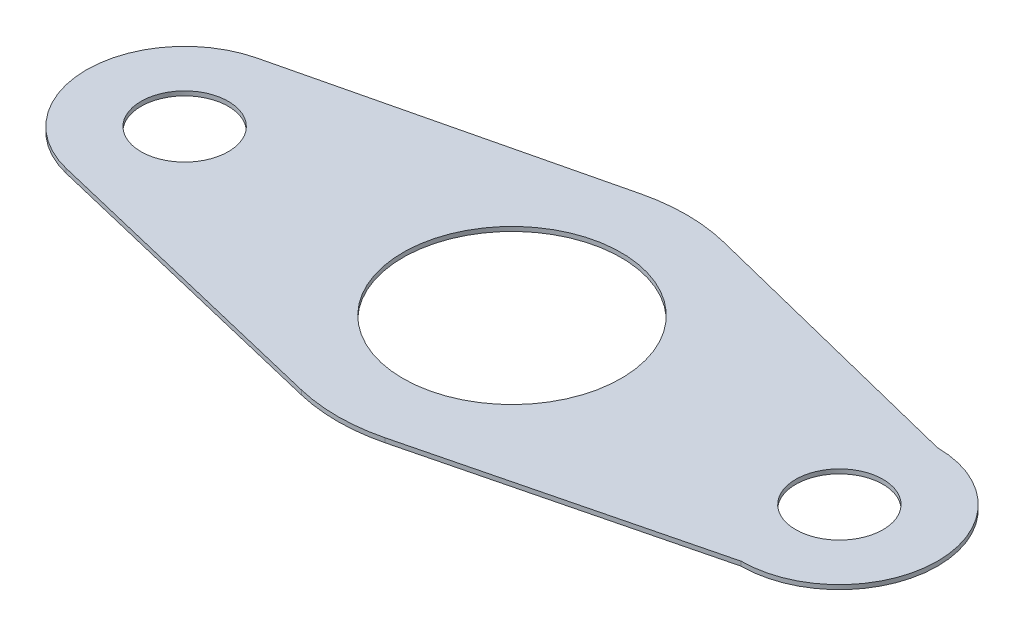
ISO-10303-21;
HEADER;
FILE_DESCRIPTION(('STEP AP214'),'2;1');
FILE_NAME('part.step','',(''),(''),'','','');
FILE_SCHEMA(('AUTOMOTIVE_DESIGN { 1 0 10303 214 1 1 1 1 }'));
ENDSEC;
DATA;
#1=APPLICATION_CONTEXT('core data for automotive mechanical design processes');
#2=APPLICATION_PROTOCOL_DEFINITION('international standard','automotive_design',2000,#1);
#3=PRODUCT_CONTEXT('',#1,'mechanical');
#4=PRODUCT('Part','Part','',(#3));
#5=PRODUCT_RELATED_PRODUCT_CATEGORY('part','',(#4));
#6=PRODUCT_DEFINITION_FORMATION('','',#4);
#7=PRODUCT_DEFINITION_CONTEXT('part definition',#1,'design');
#8=PRODUCT_DEFINITION('design','',#6,#7);
#9=PRODUCT_DEFINITION_SHAPE('','',#8);
#10=(LENGTH_UNIT() NAMED_UNIT(*) SI_UNIT(.MILLI.,.METRE.));
#11=(NAMED_UNIT(*) PLANE_ANGLE_UNIT() SI_UNIT($,.RADIAN.));
#12=(NAMED_UNIT(*) SI_UNIT($,.STERADIAN.) SOLID_ANGLE_UNIT());
#13=UNCERTAINTY_MEASURE_WITH_UNIT(LENGTH_MEASURE(1.E-05),#10,'distance_accuracy_value','');
#14=(GEOMETRIC_REPRESENTATION_CONTEXT(3) GLOBAL_UNCERTAINTY_ASSIGNED_CONTEXT((#13)) GLOBAL_UNIT_ASSIGNED_CONTEXT((#10,
#11,#12)) REPRESENTATION_CONTEXT('',''));
#15=CARTESIAN_POINT('',(0.,0.,0.));
#16=DIRECTION('',(0.,0.,1.));
#17=DIRECTION('',(1.,0.,0.));
#18=AXIS2_PLACEMENT_3D('',#15,#16,#17);
#19=CARTESIAN_POINT('',(-9.33333333333335,1.,-38.8958723888395));
#20=DIRECTION('',(0.233333333333334,0.,0.972396809720988));
#21=DIRECTION('',(0.972396809720988,0.,-0.233333333333334));
#22=AXIS2_PLACEMENT_3D('',#19,#20,#21);
#23=PLANE('',#22);
#24=DIRECTION('',(-0.972396809720988,0.,0.233333333333334));
#25=VECTOR('',#24,1.);
#26=CARTESIAN_POINT('',(-9.33333333333335,0.,-38.8958723888395));
#27=LINE('',#26,#25);
#28=CARTESIAN_POINT('',(-9.33333333333335,0.,-38.8958723888395));
#29=VERTEX_POINT('',#28);
#30=CARTESIAN_POINT('',(-80.25,0.,-21.8789282187222));
#31=VERTEX_POINT('',#30);
#32=EDGE_CURVE('E143',#29,#31,#27,.T.);
#33=ORIENTED_EDGE('',*,*,#32,.T.);
#34=DIRECTION('',(0.,-1.,0.));
#35=VECTOR('',#34,1.);
#36=CARTESIAN_POINT('',(-80.25,1.,-21.8789282187222));
#37=LINE('',#36,#35);
#38=CARTESIAN_POINT('',(-80.25,1.,-21.8789282187222));
#39=VERTEX_POINT('',#38);
#40=EDGE_CURVE('E11',#39,#31,#37,.T.);
#41=ORIENTED_EDGE('',*,*,#40,.F.);
#42=DIRECTION('',(-0.972396809720988,0.,0.233333333333334));
#43=VECTOR('',#42,1.);
#44=CARTESIAN_POINT('',(-9.33333333333335,1.,-38.8958723888395));
#45=LINE('',#44,#43);
#46=CARTESIAN_POINT('',(-9.33333333333335,1.,-38.8958723888395));
#47=VERTEX_POINT('',#46);
#48=EDGE_CURVE('E167',#47,#39,#45,.T.);
#49=ORIENTED_EDGE('',*,*,#48,.F.);
#50=DIRECTION('',(0.,-1.,0.));
#51=VECTOR('',#50,1.);
#52=CARTESIAN_POINT('',(-9.33333333333335,1.,-38.8958723888395));
#53=LINE('',#52,#51);
#54=EDGE_CURVE('E142',#47,#29,#53,.T.);
#55=ORIENTED_EDGE('',*,*,#54,.T.);
#56=EDGE_LOOP('',(#33,#41,#49,#55));
#57=FACE_BOUND('',#56,.T.);
#58=ADVANCED_FACE('F37',(#57),#23,.F.);
#59=CARTESIAN_POINT('',(-75.,1.,0.));
#60=DIRECTION('',(0.,-1.,0.));
#61=DIRECTION('',(0.,0.,-1.));
#62=AXIS2_PLACEMENT_3D('',#59,#60,#61);
#63=CYLINDRICAL_SURFACE('',#62,22.5);
#64=CARTESIAN_POINT('',(-75.,0.,0.));
#65=DIRECTION('',(0.,1.,0.));
#66=DIRECTION('',(0.,0.,1.));
#67=AXIS2_PLACEMENT_3D('',#64,#65,#66);
#68=CIRCLE('',#67,22.5);
#69=CARTESIAN_POINT('',(-80.25,0.,21.8789282187222));
#70=VERTEX_POINT('',#69);
#71=EDGE_CURVE('E146',#31,#70,#68,.T.);
#72=ORIENTED_EDGE('',*,*,#71,.T.);
#73=DIRECTION('',(0.,-1.,0.));
#74=VECTOR('',#73,1.);
#75=CARTESIAN_POINT('',(-80.25,1.,21.8789282187222));
#76=LINE('',#75,#74);
#77=CARTESIAN_POINT('',(-80.25,1.,21.8789282187222));
#78=VERTEX_POINT('',#77);
#79=EDGE_CURVE('E45',#78,#70,#76,.T.);
#80=ORIENTED_EDGE('',*,*,#79,.F.);
#81=CARTESIAN_POINT('',(-75.,1.,0.));
#82=DIRECTION('',(0.,1.,0.));
#83=DIRECTION('',(0.,0.,1.));
#84=AXIS2_PLACEMENT_3D('',#81,#82,#83);
#85=CIRCLE('',#84,22.5);
#86=EDGE_CURVE('E96',#39,#78,#85,.T.);
#87=ORIENTED_EDGE('',*,*,#86,.F.);
#88=ORIENTED_EDGE('',*,*,#40,.T.);
#89=EDGE_LOOP('',(#72,#80,#87,#88));
#90=FACE_BOUND('',#89,.T.);
#91=ADVANCED_FACE('F198',(#90),#63,.T.);
#92=CARTESIAN_POINT('',(-9.33333333333333,1.,38.8958723888395));
#93=DIRECTION('',(0.233333333333333,0.,-0.972396809720988));
#94=DIRECTION('',(-0.972396809720988,0.,-0.233333333333333));
#95=AXIS2_PLACEMENT_3D('',#92,#93,#94);
#96=PLANE('',#95);
#97=DIRECTION('',(0.972396809720988,0.,0.233333333333333));
#98=VECTOR('',#97,1.);
#99=CARTESIAN_POINT('',(-9.33333333333333,0.,38.8958723888395));
#100=LINE('',#99,#98);
#101=CARTESIAN_POINT('',(-9.33333333333334,0.,38.8958723888395));
#102=VERTEX_POINT('',#101);
#103=EDGE_CURVE('E148',#70,#102,#100,.T.);
#104=ORIENTED_EDGE('',*,*,#103,.T.);
#105=DIRECTION('',(0.,-1.,0.));
#106=VECTOR('',#105,1.);
#107=CARTESIAN_POINT('',(-9.33333333333334,1.,38.8958723888395));
#108=LINE('',#107,#106);
#109=CARTESIAN_POINT('',(-9.33333333333334,1.,38.8958723888395));
#110=VERTEX_POINT('',#109);
#111=EDGE_CURVE('E173',#110,#102,#108,.T.);
#112=ORIENTED_EDGE('',*,*,#111,.F.);
#113=DIRECTION('',(0.972396809720988,0.,0.233333333333333));
#114=VECTOR('',#113,1.);
#115=CARTESIAN_POINT('',(-9.33333333333333,1.,38.8958723888395));
#116=LINE('',#115,#114);
#117=EDGE_CURVE('E181',#78,#110,#116,.T.);
#118=ORIENTED_EDGE('',*,*,#117,.F.);
#119=ORIENTED_EDGE('',*,*,#79,.T.);
#120=EDGE_LOOP('',(#104,#112,#118,#119));
#121=FACE_BOUND('',#120,.T.);
#122=ADVANCED_FACE('F179',(#121),#96,.F.);
#123=CARTESIAN_POINT('',(0.,1.,0.));
#124=DIRECTION('',(0.,-1.,0.));
#125=DIRECTION('',(0.,0.,-1.));
#126=AXIS2_PLACEMENT_3D('',#123,#124,#125);
#127=CYLINDRICAL_SURFACE('',#126,40.);
#128=CARTESIAN_POINT('',(0.,0.,0.));
#129=DIRECTION('',(0.,1.,0.));
#130=DIRECTION('',(0.,0.,1.));
#131=AXIS2_PLACEMENT_3D('',#128,#129,#130);
#132=CIRCLE('',#131,40.);
#133=CARTESIAN_POINT('',(9.69082910005901,0.,38.8083474442477));
#134=VERTEX_POINT('',#133);
#135=EDGE_CURVE('E150',#102,#134,#132,.T.);
#136=ORIENTED_EDGE('',*,*,#135,.T.);
#137=DIRECTION('',(0.,-1.,0.));
#138=VECTOR('',#137,1.);
#139=CARTESIAN_POINT('',(9.69082910005901,1.,38.8083474442477));
#140=LINE('',#139,#138);
#141=CARTESIAN_POINT('',(9.69082910005901,1.,38.8083474442477));
#142=VERTEX_POINT('',#141);
#143=EDGE_CURVE('E171',#142,#134,#140,.T.);
#144=ORIENTED_EDGE('',*,*,#143,.F.);
#145=CARTESIAN_POINT('',(0.,1.,0.));
#146=DIRECTION('',(0.,1.,0.));
#147=DIRECTION('',(0.,0.,1.));
#148=AXIS2_PLACEMENT_3D('',#145,#146,#147);
#149=CIRCLE('',#148,40.);
#150=EDGE_CURVE('E131',#110,#142,#149,.T.);
#151=ORIENTED_EDGE('',*,*,#150,.F.);
#152=ORIENTED_EDGE('',*,*,#111,.T.);
#153=EDGE_LOOP('',(#136,#144,#151,#152));
#154=FACE_BOUND('',#153,.T.);
#155=ADVANCED_FACE('F190',(#154),#127,.T.);
#156=CARTESIAN_POINT('',(9.69082910005901,1.,38.8083474442477));
#157=DIRECTION('',(0.242270727501475,0.,0.970208686106193));
#158=DIRECTION('',(0.970208686106193,0.,-0.242270727501475));
#159=AXIS2_PLACEMENT_3D('',#156,#157,#158);
#160=PLANE('',#159);
#161=DIRECTION('',(-0.970208686106193,0.,0.242270727501475));
#162=VECTOR('',#161,1.);
#163=CARTESIAN_POINT('',(9.69082910005901,0.,38.8083474442477));
#164=LINE('',#163,#162);
#165=CARTESIAN_POINT('',(75.,0.,22.5));
#166=VERTEX_POINT('',#165);
#167=EDGE_CURVE('E153',#166,#134,#164,.T.);
#168=ORIENTED_EDGE('',*,*,#167,.F.);
#169=DIRECTION('',(0.,-1.,0.));
#170=VECTOR('',#169,1.);
#171=CARTESIAN_POINT('',(75.,1.,22.5));
#172=LINE('',#171,#170);
#173=CARTESIAN_POINT('',(75.,1.,22.5));
#174=VERTEX_POINT('',#173);
#175=EDGE_CURVE('E124',#174,#166,#172,.T.);
#176=ORIENTED_EDGE('',*,*,#175,.F.);
#177=DIRECTION('',(-0.970208686106193,0.,0.242270727501475));
#178=VECTOR('',#177,1.);
#179=CARTESIAN_POINT('',(9.69082910005901,1.,38.8083474442477));
#180=LINE('',#179,#178);
#181=EDGE_CURVE('E117',#174,#142,#180,.T.);
#182=ORIENTED_EDGE('',*,*,#181,.T.);
#183=ORIENTED_EDGE('',*,*,#143,.T.);
#184=EDGE_LOOP('',(#168,#176,#182,#183));
#185=FACE_BOUND('',#184,.T.);
#186=ADVANCED_FACE('F206',(#185),#160,.T.);
#187=CARTESIAN_POINT('',(75.,1.,0.));
#188=DIRECTION('',(0.,-1.,0.));
#189=DIRECTION('',(0.,0.,-1.));
#190=AXIS2_PLACEMENT_3D('',#187,#188,#189);
#191=CYLINDRICAL_SURFACE('',#190,22.5);
#192=CARTESIAN_POINT('',(75.,0.,0.));
#193=DIRECTION('',(0.,1.,0.));
#194=DIRECTION('',(0.,0.,1.));
#195=AXIS2_PLACEMENT_3D('',#192,#193,#194);
#196=CIRCLE('',#195,22.5);
#197=CARTESIAN_POINT('',(75.,0.,-22.5));
#198=VERTEX_POINT('',#197);
#199=EDGE_CURVE('E123',#166,#198,#196,.T.);
#200=ORIENTED_EDGE('',*,*,#199,.T.);
#201=DIRECTION('',(0.,-1.,0.));
#202=VECTOR('',#201,1.);
#203=CARTESIAN_POINT('',(75.,1.,-22.5));
#204=LINE('',#203,#202);
#205=CARTESIAN_POINT('',(75.,1.,-22.5));
#206=VERTEX_POINT('',#205);
#207=EDGE_CURVE('E120',#206,#198,#204,.T.);
#208=ORIENTED_EDGE('',*,*,#207,.F.);
#209=CARTESIAN_POINT('',(75.,1.,0.));
#210=DIRECTION('',(0.,1.,0.));
#211=DIRECTION('',(0.,0.,1.));
#212=AXIS2_PLACEMENT_3D('',#209,#210,#211);
#213=CIRCLE('',#212,22.5);
#214=EDGE_CURVE('E110',#174,#206,#213,.T.);
#215=ORIENTED_EDGE('',*,*,#214,.F.);
#216=ORIENTED_EDGE('',*,*,#175,.T.);
#217=EDGE_LOOP('',(#200,#208,#215,#216));
#218=FACE_BOUND('',#217,.T.);
#219=ADVANCED_FACE('F121',(#218),#191,.T.);
#220=CARTESIAN_POINT('',(9.69082910005899,1.,-38.8083474442477));
#221=DIRECTION('',(-0.242270727501475,0.,0.970208686106193));
#222=DIRECTION('',(0.970208686106193,0.,0.242270727501475));
#223=AXIS2_PLACEMENT_3D('',#220,#221,#222);
#224=PLANE('',#223);
#225=DIRECTION('',(-0.970208686106193,0.,-0.242270727501475));
#226=VECTOR('',#225,1.);
#227=CARTESIAN_POINT('',(9.69082910005899,0.,-38.8083474442477));
#228=LINE('',#227,#226);
#229=CARTESIAN_POINT('',(9.690829100059,0.,-38.8083474442477));
#230=VERTEX_POINT('',#229);
#231=EDGE_CURVE('E82',#198,#230,#228,.T.);
#232=ORIENTED_EDGE('',*,*,#231,.T.);
#233=DIRECTION('',(0.,-1.,0.));
#234=VECTOR('',#233,1.);
#235=CARTESIAN_POINT('',(9.690829100059,1.,-38.8083474442477));
#236=LINE('',#235,#234);
#237=CARTESIAN_POINT('',(9.690829100059,1.,-38.8083474442477));
#238=VERTEX_POINT('',#237);
#239=EDGE_CURVE('E125',#238,#230,#236,.T.);
#240=ORIENTED_EDGE('',*,*,#239,.F.);
#241=DIRECTION('',(-0.970208686106193,0.,-0.242270727501475));
#242=VECTOR('',#241,1.);
#243=CARTESIAN_POINT('',(9.69082910005899,1.,-38.8083474442477));
#244=LINE('',#243,#242);
#245=EDGE_CURVE('E115',#206,#238,#244,.T.);
#246=ORIENTED_EDGE('',*,*,#245,.F.);
#247=ORIENTED_EDGE('',*,*,#207,.T.);
#248=EDGE_LOOP('',(#232,#240,#246,#247));
#249=FACE_BOUND('',#248,.T.);
#250=ADVANCED_FACE('F127',(#249),#224,.F.);
#251=CARTESIAN_POINT('',(0.,1.,0.));
#252=DIRECTION('',(0.,-1.,0.));
#253=DIRECTION('',(0.,0.,-1.));
#254=AXIS2_PLACEMENT_3D('',#251,#252,#253);
#255=CYLINDRICAL_SURFACE('',#254,25.);
#256=CARTESIAN_POINT('',(0.,1.,0.));
#257=DIRECTION('',(0.,1.,0.));
#258=DIRECTION('',(0.,0.,1.));
#259=AXIS2_PLACEMENT_3D('',#256,#257,#258);
#260=CIRCLE('',#259,25.);
#261=CARTESIAN_POINT('',(0.,1.,25.));
#262=VERTEX_POINT('',#261);
#263=EDGE_CURVE('E136',#262,#262,#260,.T.);
#264=ORIENTED_EDGE('',*,*,#263,.T.);
#265=EDGE_LOOP('',(#264));
#266=FACE_BOUND('',#265,.T.);
#267=CARTESIAN_POINT('',(0.,0.,0.));
#268=DIRECTION('',(0.,1.,0.));
#269=DIRECTION('',(0.,0.,1.));
#270=AXIS2_PLACEMENT_3D('',#267,#268,#269);
#271=CIRCLE('',#270,25.);
#272=CARTESIAN_POINT('',(0.,0.,25.));
#273=VERTEX_POINT('',#272);
#274=EDGE_CURVE('E161',#273,#273,#271,.T.);
#275=ORIENTED_EDGE('',*,*,#274,.F.);
#276=EDGE_LOOP('',(#275));
#277=FACE_BOUND('',#276,.T.);
#278=ADVANCED_FACE('F214',(#266,#277),#255,.F.);
#279=CARTESIAN_POINT('',(-75.,1.,0.));
#280=DIRECTION('',(0.,-1.,0.));
#281=DIRECTION('',(0.,0.,-1.));
#282=AXIS2_PLACEMENT_3D('',#279,#280,#281);
#283=CYLINDRICAL_SURFACE('',#282,9.99999999999999);
#284=CARTESIAN_POINT('',(-75.,1.,0.));
#285=DIRECTION('',(0.,1.,0.));
#286=DIRECTION('',(0.,0.,1.));
#287=AXIS2_PLACEMENT_3D('',#284,#285,#286);
#288=CIRCLE('',#287,9.99999999999999);
#289=CARTESIAN_POINT('',(-75.,1.,9.99999999999999));
#290=VERTEX_POINT('',#289);
#291=EDGE_CURVE('E129',#290,#290,#288,.T.);
#292=ORIENTED_EDGE('',*,*,#291,.T.);
#293=EDGE_LOOP('',(#292));
#294=FACE_BOUND('',#293,.T.);
#295=CARTESIAN_POINT('',(-75.,0.,0.));
#296=DIRECTION('',(0.,1.,0.));
#297=DIRECTION('',(0.,0.,1.));
#298=AXIS2_PLACEMENT_3D('',#295,#296,#297);
#299=CIRCLE('',#298,9.99999999999999);
#300=CARTESIAN_POINT('',(-75.,0.,9.99999999999999));
#301=VERTEX_POINT('',#300);
#302=EDGE_CURVE('E158',#301,#301,#299,.T.);
#303=ORIENTED_EDGE('',*,*,#302,.F.);
#304=EDGE_LOOP('',(#303));
#305=FACE_BOUND('',#304,.T.);
#306=ADVANCED_FACE('F219',(#294,#305),#283,.F.);
#307=EDGE_CURVE('E88',#230,#29,#132,.T.);
#308=ORIENTED_EDGE('',*,*,#307,.T.);
#309=ORIENTED_EDGE('',*,*,#54,.F.);
#310=EDGE_CURVE('E53',#238,#47,#149,.T.);
#311=ORIENTED_EDGE('',*,*,#310,.F.);
#312=ORIENTED_EDGE('',*,*,#239,.T.);
#313=EDGE_LOOP('',(#308,#309,#311,#312));
#314=FACE_BOUND('',#313,.T.);
#315=ADVANCED_FACE('F215',(#314),#127,.T.);
#316=CARTESIAN_POINT('',(75.,1.,0.));
#317=DIRECTION('',(0.,-1.,0.));
#318=DIRECTION('',(0.,0.,-1.));
#319=AXIS2_PLACEMENT_3D('',#316,#317,#318);
#320=CYLINDRICAL_SURFACE('',#319,9.99999999999999);
#321=CARTESIAN_POINT('',(75.,1.,0.));
#322=DIRECTION('',(0.,1.,0.));
#323=DIRECTION('',(0.,0.,1.));
#324=AXIS2_PLACEMENT_3D('',#321,#322,#323);
#325=CIRCLE('',#324,9.99999999999999);
#326=CARTESIAN_POINT('',(75.,1.,9.99999999999999));
#327=VERTEX_POINT('',#326);
#328=EDGE_CURVE('E139',#327,#327,#325,.T.);
#329=ORIENTED_EDGE('',*,*,#328,.T.);
#330=EDGE_LOOP('',(#329));
#331=FACE_BOUND('',#330,.T.);
#332=CARTESIAN_POINT('',(75.,0.,0.));
#333=DIRECTION('',(0.,1.,0.));
#334=DIRECTION('',(0.,0.,1.));
#335=AXIS2_PLACEMENT_3D('',#332,#333,#334);
#336=CIRCLE('',#335,9.99999999999999);
#337=CARTESIAN_POINT('',(75.,0.,9.99999999999999));
#338=VERTEX_POINT('',#337);
#339=EDGE_CURVE('E164',#338,#338,#336,.T.);
#340=ORIENTED_EDGE('',*,*,#339,.F.);
#341=EDGE_LOOP('',(#340));
#342=FACE_BOUND('',#341,.T.);
#343=ADVANCED_FACE('F218',(#331,#342),#320,.F.);
#344=CARTESIAN_POINT('',(0.,1.,0.));
#345=DIRECTION('',(0.,1.,0.));
#346=DIRECTION('',(0.,0.,1.));
#347=AXIS2_PLACEMENT_3D('',#344,#345,#346);
#348=PLANE('',#347);
#349=ORIENTED_EDGE('',*,*,#48,.T.);
#350=ORIENTED_EDGE('',*,*,#86,.T.);
#351=ORIENTED_EDGE('',*,*,#117,.T.);
#352=ORIENTED_EDGE('',*,*,#150,.T.);
#353=ORIENTED_EDGE('',*,*,#181,.F.);
#354=ORIENTED_EDGE('',*,*,#214,.T.);
#355=ORIENTED_EDGE('',*,*,#245,.T.);
#356=ORIENTED_EDGE('',*,*,#310,.T.);
#357=EDGE_LOOP('',(#349,#350,#351,#352,#353,#354,#355,#356));
#358=FACE_BOUND('',#357,.T.);
#359=ORIENTED_EDGE('',*,*,#291,.F.);
#360=EDGE_LOOP('',(#359));
#361=FACE_BOUND('',#360,.T.);
#362=ORIENTED_EDGE('',*,*,#263,.F.);
#363=EDGE_LOOP('',(#362));
#364=FACE_BOUND('',#363,.T.);
#365=ORIENTED_EDGE('',*,*,#328,.F.);
#366=EDGE_LOOP('',(#365));
#367=FACE_BOUND('',#366,.T.);
#368=ADVANCED_FACE('F112',(#358,#361,#364,#367),#348,.T.);
#369=CARTESIAN_POINT('',(0.,0.,0.));
#370=DIRECTION('',(0.,1.,0.));
#371=DIRECTION('',(0.,0.,1.));
#372=AXIS2_PLACEMENT_3D('',#369,#370,#371);
#373=PLANE('',#372);
#374=ORIENTED_EDGE('',*,*,#32,.F.);
#375=ORIENTED_EDGE('',*,*,#307,.F.);
#376=ORIENTED_EDGE('',*,*,#231,.F.);
#377=ORIENTED_EDGE('',*,*,#199,.F.);
#378=ORIENTED_EDGE('',*,*,#167,.T.);
#379=ORIENTED_EDGE('',*,*,#135,.F.);
#380=ORIENTED_EDGE('',*,*,#103,.F.);
#381=ORIENTED_EDGE('',*,*,#71,.F.);
#382=EDGE_LOOP('',(#374,#375,#376,#377,#378,#379,#380,#381));
#383=FACE_BOUND('',#382,.T.);
#384=ORIENTED_EDGE('',*,*,#302,.T.);
#385=EDGE_LOOP('',(#384));
#386=FACE_BOUND('',#385,.T.);
#387=ORIENTED_EDGE('',*,*,#274,.T.);
#388=EDGE_LOOP('',(#387));
#389=FACE_BOUND('',#388,.T.);
#390=ORIENTED_EDGE('',*,*,#339,.T.);
#391=EDGE_LOOP('',(#390));
#392=FACE_BOUND('',#391,.T.);
#393=ADVANCED_FACE('F185',(#383,#386,#389,#392),#373,.F.);
#394=CLOSED_SHELL('',(#58,#91,#122,#155,#186,#219,#250,#278,#306,#315,#343,#368,#393));
#395=MANIFOLD_SOLID_BREP('B2',#394);
#396=ADVANCED_BREP_SHAPE_REPRESENTATION('',(#18,#395),#14);
#397=SHAPE_DEFINITION_REPRESENTATION(#9,#396);
ENDSEC;
END-ISO-10303-21;
